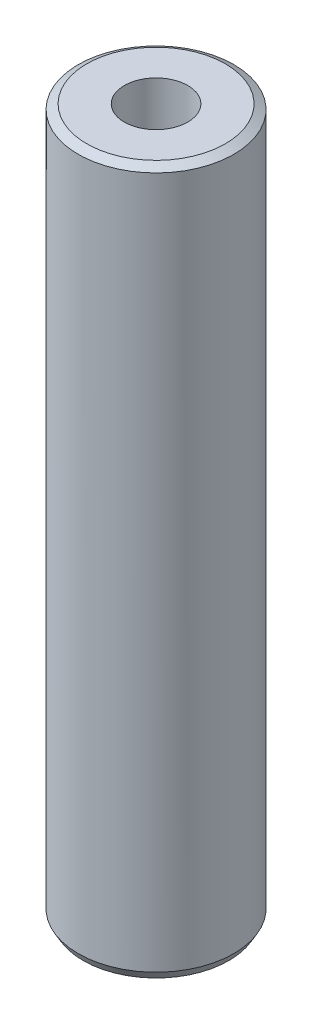
ISO-10303-21;
HEADER;
FILE_DESCRIPTION(('STEP AP214'),'2;1');
FILE_NAME('part.step','',(''),(''),'','','');
FILE_SCHEMA(('AUTOMOTIVE_DESIGN { 1 0 10303 214 1 1 1 1 }'));
ENDSEC;
DATA;
#1=APPLICATION_CONTEXT('core data for automotive mechanical design processes');
#2=APPLICATION_PROTOCOL_DEFINITION('international standard','automotive_design',2000,#1);
#3=PRODUCT_CONTEXT('',#1,'mechanical');
#4=PRODUCT('Part','Part','',(#3));
#5=PRODUCT_RELATED_PRODUCT_CATEGORY('part','',(#4));
#6=PRODUCT_DEFINITION_FORMATION('','',#4);
#7=PRODUCT_DEFINITION_CONTEXT('part definition',#1,'design');
#8=PRODUCT_DEFINITION('design','',#6,#7);
#9=PRODUCT_DEFINITION_SHAPE('','',#8);
#10=(LENGTH_UNIT() NAMED_UNIT(*) SI_UNIT(.MILLI.,.METRE.));
#11=(NAMED_UNIT(*) PLANE_ANGLE_UNIT() SI_UNIT($,.RADIAN.));
#12=(NAMED_UNIT(*) SI_UNIT($,.STERADIAN.) SOLID_ANGLE_UNIT());
#13=UNCERTAINTY_MEASURE_WITH_UNIT(LENGTH_MEASURE(1.E-05),#10,'distance_accuracy_value','');
#14=(GEOMETRIC_REPRESENTATION_CONTEXT(3) GLOBAL_UNCERTAINTY_ASSIGNED_CONTEXT((#13)) GLOBAL_UNIT_ASSIGNED_CONTEXT((#10,
#11,#12)) REPRESENTATION_CONTEXT('',''));
#15=CARTESIAN_POINT('',(0.,0.,0.));
#16=DIRECTION('',(0.,0.,1.));
#17=DIRECTION('',(1.,0.,0.));
#18=AXIS2_PLACEMENT_3D('',#15,#16,#17);
#19=CARTESIAN_POINT('',(0.,272.101556013869,0.));
#20=DIRECTION('',(0.,-1.,0.));
#21=DIRECTION('',(0.,0.,-1.));
#22=AXIS2_PLACEMENT_3D('',#19,#20,#21);
#23=CYLINDRICAL_SURFACE('',#22,30.);
#24=CARTESIAN_POINT('',(0.,270.211689167662,0.));
#25=DIRECTION('',(0.,1.,0.));
#26=DIRECTION('',(0.,0.,1.));
#27=AXIS2_PLACEMENT_3D('',#24,#25,#26);
#28=CIRCLE('',#27,30.);
#29=CARTESIAN_POINT('',(0.,270.211689167662,-30.));
#30=VERTEX_POINT('',#29);
#31=EDGE_CURVE('E50',#30,#30,#28,.F.);
#32=ORIENTED_EDGE('',*,*,#31,.T.);
#33=EDGE_LOOP('',(#32));
#34=FACE_BOUND('',#33,.T.);
#35=CARTESIAN_POINT('',(0.,3.27334539717172,0.));
#36=DIRECTION('',(0.,1.,0.));
#37=DIRECTION('',(0.,0.,1.));
#38=AXIS2_PLACEMENT_3D('',#35,#36,#37);
#39=CIRCLE('',#38,30.);
#40=CARTESIAN_POINT('',(0.,3.27334539717172,30.));
#41=VERTEX_POINT('',#40);
#42=EDGE_CURVE('E51',#41,#41,#39,.T.);
#43=ORIENTED_EDGE('',*,*,#42,.T.);
#44=EDGE_LOOP('',(#43));
#45=FACE_BOUND('',#44,.T.);
#46=ADVANCED_FACE('F39',(#34,#45),#23,.T.);
#47=CARTESIAN_POINT('',(0.,272.101556013869,0.));
#48=DIRECTION('',(0.,1.,0.));
#49=DIRECTION('',(0.,0.,1.));
#50=AXIS2_PLACEMENT_3D('',#47,#48,#49);
#51=PLANE('',#50);
#52=CARTESIAN_POINT('',(0.,272.101556013869,0.));
#53=DIRECTION('',(0.,1.,0.));
#54=DIRECTION('',(0.,0.,1.));
#55=AXIS2_PLACEMENT_3D('',#52,#53,#54);
#56=CIRCLE('',#55,26.7266546028284);
#57=CARTESIAN_POINT('',(0.,272.101556013869,-26.7266546028285));
#58=VERTEX_POINT('',#57);
#59=EDGE_CURVE('E54',#58,#58,#56,.T.);
#60=ORIENTED_EDGE('',*,*,#59,.T.);
#61=EDGE_LOOP('',(#60));
#62=FACE_BOUND('',#61,.T.);
#63=CARTESIAN_POINT('',(0.,272.101556013869,0.));
#64=DIRECTION('',(0.,1.,0.));
#65=DIRECTION('',(0.,0.,1.));
#66=AXIS2_PLACEMENT_3D('',#63,#64,#65);
#67=CIRCLE('',#66,12.2340613817163);
#68=CARTESIAN_POINT('',(0.,272.101556013869,12.2340613817163));
#69=VERTEX_POINT('',#68);
#70=EDGE_CURVE('E58',#69,#69,#67,.T.);
#71=ORIENTED_EDGE('',*,*,#70,.F.);
#72=EDGE_LOOP('',(#71));
#73=FACE_BOUND('',#72,.T.);
#74=ADVANCED_FACE('F69',(#62,#73),#51,.T.);
#75=CARTESIAN_POINT('',(0.,0.,0.));
#76=DIRECTION('',(0.,1.,0.));
#77=DIRECTION('',(0.,0.,1.));
#78=AXIS2_PLACEMENT_3D('',#75,#76,#77);
#79=PLANE('',#78);
#80=CARTESIAN_POINT('',(0.,0.,0.));
#81=DIRECTION('',(0.,1.,0.));
#82=DIRECTION('',(0.,0.,1.));
#83=AXIS2_PLACEMENT_3D('',#80,#81,#82);
#84=CIRCLE('',#83,28.1101331537923);
#85=CARTESIAN_POINT('',(0.,0.,28.1101331537923));
#86=VERTEX_POINT('',#85);
#87=EDGE_CURVE('E10',#86,#86,#84,.F.);
#88=ORIENTED_EDGE('',*,*,#87,.T.);
#89=EDGE_LOOP('',(#88));
#90=FACE_BOUND('',#89,.T.);
#91=CARTESIAN_POINT('',(0.,0.,0.));
#92=DIRECTION('',(0.,1.,0.));
#93=DIRECTION('',(0.,0.,1.));
#94=AXIS2_PLACEMENT_3D('',#91,#92,#93);
#95=CIRCLE('',#94,12.2340613817163);
#96=CARTESIAN_POINT('',(0.,0.,12.2340613817163));
#97=VERTEX_POINT('',#96);
#98=EDGE_CURVE('E63',#97,#97,#95,.T.);
#99=ORIENTED_EDGE('',*,*,#98,.T.);
#100=EDGE_LOOP('',(#99));
#101=FACE_BOUND('',#100,.T.);
#102=ADVANCED_FACE('F75',(#90,#101),#79,.F.);
#103=CARTESIAN_POINT('',(0.,272.101556013869,0.));
#104=DIRECTION('',(0.,-1.,0.));
#105=DIRECTION('',(0.,0.,-1.));
#106=AXIS2_PLACEMENT_3D('',#103,#104,#105);
#107=CYLINDRICAL_SURFACE('',#106,12.2340613817163);
#108=ORIENTED_EDGE('',*,*,#70,.T.);
#109=EDGE_LOOP('',(#108));
#110=FACE_BOUND('',#109,.T.);
#111=ORIENTED_EDGE('',*,*,#98,.F.);
#112=EDGE_LOOP('',(#111));
#113=FACE_BOUND('',#112,.T.);
#114=ADVANCED_FACE('F70',(#110,#113),#107,.F.);
#115=CARTESIAN_POINT('',(0.,272.101556013869,0.));
#116=DIRECTION('',(0.,-1.,0.));
#117=DIRECTION('',(0.,0.,-1.));
#118=AXIS2_PLACEMENT_3D('',#115,#116,#117);
#119=CONICAL_SURFACE('',#118,26.7266546028284,1.04719755119659);
#120=CARTESIAN_POINT('',(0.,270.211689167662,-30.));
#121=CARTESIAN_POINT('',(0.,270.231375280643,-29.9659026521128));
#122=CARTESIAN_POINT('',(0.,270.251061393624,-29.9318053042256));
#123=CARTESIAN_POINT('',(0.,270.290433619587,-29.8636106084512));
#124=CARTESIAN_POINT('',(0.,270.310119732568,-29.829513260564));
#125=CARTESIAN_POINT('',(0.,270.349491958531,-29.7613185647896));
#126=CARTESIAN_POINT('',(0.,270.369178071512,-29.7272212169024));
#127=CARTESIAN_POINT('',(0.,270.408550297475,-29.659026521128));
#128=CARTESIAN_POINT('',(0.,270.428236410456,-29.6249291732408));
#129=CARTESIAN_POINT('',(0.,270.467608636419,-29.5567344774664));
#130=CARTESIAN_POINT('',(0.,270.4872947494,-29.5226371295792));
#131=CARTESIAN_POINT('',(0.,270.526666975363,-29.4544424338048));
#132=CARTESIAN_POINT('',(0.,270.546353088344,-29.4203450859176));
#133=CARTESIAN_POINT('',(0.,270.585725314307,-29.3521503901432));
#134=CARTESIAN_POINT('',(0.,270.605411427288,-29.318053042256));
#135=CARTESIAN_POINT('',(0.,270.644783653251,-29.2498583464816));
#136=CARTESIAN_POINT('',(0.,270.664469766232,-29.2157609985944));
#137=CARTESIAN_POINT('',(0.,270.703841992195,-29.1475663028199));
#138=CARTESIAN_POINT('',(0.,270.723528105176,-29.1134689549327));
#139=CARTESIAN_POINT('',(0.,270.762900331139,-29.0452742591583));
#140=CARTESIAN_POINT('',(0.,270.78258644412,-29.0111769112711));
#141=CARTESIAN_POINT('',(0.,270.821958670083,-28.9429822154967));
#142=CARTESIAN_POINT('',(0.,270.841644783064,-28.9088848676095));
#143=CARTESIAN_POINT('',(0.,270.881017009027,-28.8406901718351));
#144=CARTESIAN_POINT('',(0.,270.900703122008,-28.8065928239479));
#145=CARTESIAN_POINT('',(0.,270.940075347971,-28.7383981281735));
#146=CARTESIAN_POINT('',(0.,270.959761460952,-28.7043007802863));
#147=CARTESIAN_POINT('',(0.,270.999133686915,-28.6361060845119));
#148=CARTESIAN_POINT('',(0.,271.018819799896,-28.6020087366247));
#149=CARTESIAN_POINT('',(0.,271.058192025859,-28.5338140408503));
#150=CARTESIAN_POINT('',(0.,271.07787813884,-28.4997166929631));
#151=CARTESIAN_POINT('',(0.,271.117250364803,-28.4315219971887));
#152=CARTESIAN_POINT('',(0.,271.136936477784,-28.3974246493015));
#153=CARTESIAN_POINT('',(0.,271.176308703747,-28.3292299535271));
#154=CARTESIAN_POINT('',(0.,271.195994816728,-28.2951326056398));
#155=CARTESIAN_POINT('',(0.,271.235367042691,-28.2269379098654));
#156=CARTESIAN_POINT('',(0.,271.255053155672,-28.1928405619782));
#157=CARTESIAN_POINT('',(0.,271.294425381635,-28.1246458662038));
#158=CARTESIAN_POINT('',(0.,271.314111494616,-28.0905485183166));
#159=CARTESIAN_POINT('',(0.,271.353483720579,-28.0223538225422));
#160=CARTESIAN_POINT('',(0.,271.37316983356,-27.988256474655));
#161=CARTESIAN_POINT('',(0.,271.412542059523,-27.9200617788806));
#162=CARTESIAN_POINT('',(0.,271.432228172504,-27.8859644309934));
#163=CARTESIAN_POINT('',(0.,271.471600398467,-27.817769735219));
#164=CARTESIAN_POINT('',(0.,271.491286511448,-27.7836723873318));
#165=CARTESIAN_POINT('',(0.,271.530658737411,-27.7154776915574));
#166=CARTESIAN_POINT('',(0.,271.550344850392,-27.6813803436702));
#167=CARTESIAN_POINT('',(0.,271.589717076355,-27.6131856478958));
#168=CARTESIAN_POINT('',(0.,271.609403189336,-27.5790883000086));
#169=CARTESIAN_POINT('',(0.,271.648775415299,-27.5108936042342));
#170=CARTESIAN_POINT('',(0.,271.66846152828,-27.476796256347));
#171=CARTESIAN_POINT('',(0.,271.707833754243,-27.4086015605725));
#172=CARTESIAN_POINT('',(0.,271.727519867224,-27.3745042126853));
#173=CARTESIAN_POINT('',(0.,271.766892093187,-27.3063095169109));
#174=CARTESIAN_POINT('',(0.,271.786578206168,-27.2722121690237));
#175=CARTESIAN_POINT('',(0.,271.825950432131,-27.2040174732493));
#176=CARTESIAN_POINT('',(0.,271.845636545112,-27.1699201253621));
#177=CARTESIAN_POINT('',(0.,271.885008771075,-27.1017254295877));
#178=CARTESIAN_POINT('',(0.,271.904694884056,-27.0676280817005));
#179=CARTESIAN_POINT('',(0.,271.944067110019,-26.9994333859261));
#180=CARTESIAN_POINT('',(0.,271.963753223,-26.9653360380389));
#181=CARTESIAN_POINT('',(0.,272.003125448963,-26.8971413422645));
#182=CARTESIAN_POINT('',(0.,272.022811561944,-26.8630439943773));
#183=CARTESIAN_POINT('',(0.,272.062183787907,-26.7948492986029));
#184=CARTESIAN_POINT('',(0.,272.081869900888,-26.7607519507157));
#185=CARTESIAN_POINT('',(0.,272.101556013869,-26.7266546028285));
#186=B_SPLINE_CURVE_WITH_KNOTS('',3,(#120,#121,#122,#123,#124,#125,#126,#127,#128,#129,#130,
#131,#132,#133,#134,#135,#136,#137,#138,#139,#140,#141,#142,#143,#144,#145,#146,#147,#148,#149,
#150,#151,#152,#153,#154,#155,#156,#157,#158,#159,#160,#161,#162,#163,#164,#165,#166,#167,#168,
#169,#170,#171,#172,#173,#174,#175,#176,#177,#178,#179,#180,#181,#182,#183,#184,#185),
.UNSPECIFIED.,.F.,.F.,(4,2,2,2,2,2,2,2,2,2,2,2,2,2,2,2,2,2,2,2,2,2,2,2,2,2,2,2,2,2,2,2,4),(0.,
0.118116677887976,0.236233355775952,0.354350033663925,0.472466711551901,0.590583389439877,
0.708700067327853,0.826816745215826,0.944933423103803,1.06305010099178,1.18116677887975,
1.29928345676776,1.41740013465573,1.53551681254371,1.65363349043168,1.77175016831966,
1.88986684620763,2.00798352409561,2.12610020198359,2.24421687987156,2.36233355775953,
2.48045023564751,2.59856691353551,2.71668359142349,2.83480026931146,2.95291694719944,
3.07103362508741,3.18915030297539,3.30726698086336,3.42538365875134,3.54350033663931,
3.66161701452729,3.77973369241529),.UNSPECIFIED.);
#187=EDGE_CURVE('BSEAM81',#30,#58,#186,.T.);
#188=ORIENTED_EDGE('',*,*,#31,.F.);
#189=ORIENTED_EDGE('',*,*,#59,.F.);
#190=ORIENTED_EDGE('',*,*,#187,.T.);
#191=ORIENTED_EDGE('',*,*,#187,.F.);
#192=EDGE_LOOP('',(#188,#190,#189,#191));
#193=FACE_BOUND('',#192,.T.);
#194=ADVANCED_FACE('F81',(#193),#119,.T.);
#195=CARTESIAN_POINT('',(0.,3.27334539717172,0.));
#196=DIRECTION('',(0.,1.,0.));
#197=DIRECTION('',(0.,0.,1.));
#198=AXIS2_PLACEMENT_3D('',#195,#196,#197);
#199=CONICAL_SURFACE('',#198,30.,0.523598775598296);
#200=ORIENTED_EDGE('',*,*,#87,.F.);
#201=EDGE_LOOP('',(#200));
#202=FACE_BOUND('',#201,.T.);
#203=ORIENTED_EDGE('',*,*,#42,.F.);
#204=EDGE_LOOP('',(#203));
#205=FACE_BOUND('',#204,.T.);
#206=ADVANCED_FACE('F45',(#202,#205),#199,.T.);
#207=CLOSED_SHELL('',(#46,#74,#102,#114,#194,#206));
#208=MANIFOLD_SOLID_BREP('B2',#207);
#209=ADVANCED_BREP_SHAPE_REPRESENTATION('',(#18,#208),#14);
#210=SHAPE_DEFINITION_REPRESENTATION(#9,#209);
ENDSEC;
END-ISO-10303-21;
